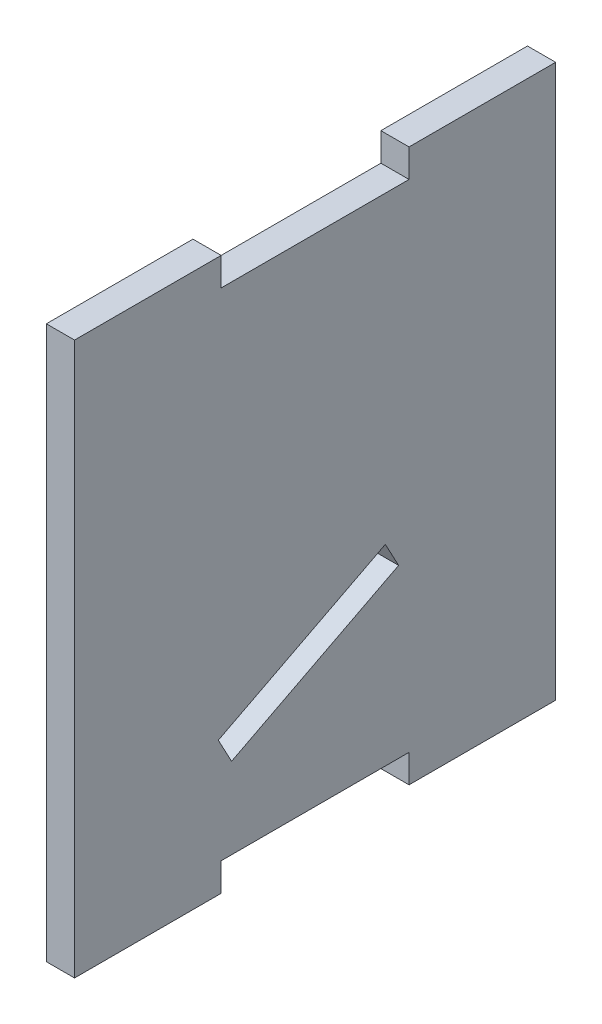
ISO-10303-21;
HEADER;
FILE_DESCRIPTION(('STEP AP214'),'2;1');
FILE_NAME('part.step','',(''),(''),'','','');
FILE_SCHEMA(('AUTOMOTIVE_DESIGN { 1 0 10303 214 1 1 1 1 }'));
ENDSEC;
DATA;
#1=APPLICATION_CONTEXT('core data for automotive mechanical design processes');
#2=APPLICATION_PROTOCOL_DEFINITION('international standard','automotive_design',2000,#1);
#3=PRODUCT_CONTEXT('',#1,'mechanical');
#4=PRODUCT('Part','Part','',(#3));
#5=PRODUCT_RELATED_PRODUCT_CATEGORY('part','',(#4));
#6=PRODUCT_DEFINITION_FORMATION('','',#4);
#7=PRODUCT_DEFINITION_CONTEXT('part definition',#1,'design');
#8=PRODUCT_DEFINITION('design','',#6,#7);
#9=PRODUCT_DEFINITION_SHAPE('','',#8);
#10=(LENGTH_UNIT() NAMED_UNIT(*) SI_UNIT(.MILLI.,.METRE.));
#11=(NAMED_UNIT(*) PLANE_ANGLE_UNIT() SI_UNIT($,.RADIAN.));
#12=(NAMED_UNIT(*) SI_UNIT($,.STERADIAN.) SOLID_ANGLE_UNIT());
#13=UNCERTAINTY_MEASURE_WITH_UNIT(LENGTH_MEASURE(1.E-05),#10,'distance_accuracy_value','');
#14=(GEOMETRIC_REPRESENTATION_CONTEXT(3) GLOBAL_UNCERTAINTY_ASSIGNED_CONTEXT((#13)) GLOBAL_UNIT_ASSIGNED_CONTEXT((#10,
#11,#12)) REPRESENTATION_CONTEXT('',''));
#15=CARTESIAN_POINT('',(0.,0.,0.));
#16=DIRECTION('',(0.,0.,1.));
#17=DIRECTION('',(1.,0.,0.));
#18=AXIS2_PLACEMENT_3D('',#15,#16,#17);
#19=CARTESIAN_POINT('',(-3.,3.,15.6043179111666));
#20=DIRECTION('',(0.,1.,0.));
#21=DIRECTION('',(0.,0.,1.));
#22=AXIS2_PLACEMENT_3D('',#19,#20,#21);
#23=PLANE('',#22);
#24=DIRECTION('',(0.,0.,1.));
#25=VECTOR('',#24,1.);
#26=CARTESIAN_POINT('',(0.,3.,15.6043179111666));
#27=LINE('',#26,#25);
#28=CARTESIAN_POINT('',(0.,3.,15.6043179111666));
#29=VERTEX_POINT('',#28);
#30=CARTESIAN_POINT('',(0.,3.,35.6043179111666));
#31=VERTEX_POINT('',#30);
#32=EDGE_CURVE('E192',#29,#31,#27,.T.);
#33=ORIENTED_EDGE('',*,*,#32,.T.);
#34=DIRECTION('',(1.,0.,0.));
#35=VECTOR('',#34,1.);
#36=CARTESIAN_POINT('',(-3.,3.,35.6043179111666));
#37=LINE('',#36,#35);
#38=CARTESIAN_POINT('',(-3.,3.,35.6043179111666));
#39=VERTEX_POINT('',#38);
#40=EDGE_CURVE('E11',#39,#31,#37,.T.);
#41=ORIENTED_EDGE('',*,*,#40,.F.);
#42=DIRECTION('',(0.,0.,1.));
#43=VECTOR('',#42,1.);
#44=CARTESIAN_POINT('',(-3.,3.,15.6043179111666));
#45=LINE('',#44,#43);
#46=CARTESIAN_POINT('',(-3.,3.,15.6043179111666));
#47=VERTEX_POINT('',#46);
#48=EDGE_CURVE('E199',#47,#39,#45,.T.);
#49=ORIENTED_EDGE('',*,*,#48,.F.);
#50=DIRECTION('',(1.,0.,0.));
#51=VECTOR('',#50,1.);
#52=CARTESIAN_POINT('',(-3.,3.,15.6043179111666));
#53=LINE('',#52,#51);
#54=EDGE_CURVE('E219',#47,#29,#53,.T.);
#55=ORIENTED_EDGE('',*,*,#54,.T.);
#56=EDGE_LOOP('',(#33,#41,#49,#55));
#57=FACE_BOUND('',#56,.T.);
#58=ADVANCED_FACE('F47',(#57),#23,.F.);
#59=CARTESIAN_POINT('',(-3.,3.,35.6043179111666));
#60=DIRECTION('',(0.,0.,1.));
#61=DIRECTION('',(1.,0.,0.));
#62=AXIS2_PLACEMENT_3D('',#59,#60,#61);
#63=PLANE('',#62);
#64=DIRECTION('',(0.,-1.,0.));
#65=VECTOR('',#64,1.);
#66=CARTESIAN_POINT('',(0.,3.,35.6043179111666));
#67=LINE('',#66,#65);
#68=CARTESIAN_POINT('',(0.,0.,35.6043179111666));
#69=VERTEX_POINT('',#68);
#70=EDGE_CURVE('E223',#31,#69,#67,.T.);
#71=ORIENTED_EDGE('',*,*,#70,.T.);
#72=DIRECTION('',(1.,0.,0.));
#73=VECTOR('',#72,1.);
#74=CARTESIAN_POINT('',(-3.,0.,35.6043179111666));
#75=LINE('',#74,#73);
#76=CARTESIAN_POINT('',(-3.,0.,35.6043179111666));
#77=VERTEX_POINT('',#76);
#78=EDGE_CURVE('E54',#77,#69,#75,.T.);
#79=ORIENTED_EDGE('',*,*,#78,.F.);
#80=DIRECTION('',(0.,-1.,0.));
#81=VECTOR('',#80,1.);
#82=CARTESIAN_POINT('',(-3.,3.,35.6043179111666));
#83=LINE('',#82,#81);
#84=EDGE_CURVE('E196',#39,#77,#83,.T.);
#85=ORIENTED_EDGE('',*,*,#84,.F.);
#86=ORIENTED_EDGE('',*,*,#40,.T.);
#87=EDGE_LOOP('',(#71,#79,#85,#86));
#88=FACE_BOUND('',#87,.T.);
#89=ADVANCED_FACE('F312',(#88),#63,.F.);
#90=CARTESIAN_POINT('',(-3.,0.,35.6043179111666));
#91=DIRECTION('',(0.,1.,0.));
#92=DIRECTION('',(0.,0.,1.));
#93=AXIS2_PLACEMENT_3D('',#90,#91,#92);
#94=PLANE('',#93);
#95=DIRECTION('',(0.,0.,1.));
#96=VECTOR('',#95,1.);
#97=CARTESIAN_POINT('',(0.,0.,35.6043179111666));
#98=LINE('',#97,#96);
#99=CARTESIAN_POINT('',(0.,0.,51.2086358223332));
#100=VERTEX_POINT('',#99);
#101=EDGE_CURVE('E226',#69,#100,#98,.T.);
#102=ORIENTED_EDGE('',*,*,#101,.T.);
#103=DIRECTION('',(1.,0.,0.));
#104=VECTOR('',#103,1.);
#105=CARTESIAN_POINT('',(-3.,0.,51.2086358223332));
#106=LINE('',#105,#104);
#107=CARTESIAN_POINT('',(-3.,0.,51.2086358223332));
#108=VERTEX_POINT('',#107);
#109=EDGE_CURVE('E284',#108,#100,#106,.T.);
#110=ORIENTED_EDGE('',*,*,#109,.F.);
#111=DIRECTION('',(0.,0.,1.));
#112=VECTOR('',#111,1.);
#113=CARTESIAN_POINT('',(-3.,0.,35.6043179111666));
#114=LINE('',#113,#112);
#115=EDGE_CURVE('E198',#77,#108,#114,.T.);
#116=ORIENTED_EDGE('',*,*,#115,.F.);
#117=ORIENTED_EDGE('',*,*,#78,.T.);
#118=EDGE_LOOP('',(#102,#110,#116,#117));
#119=FACE_BOUND('',#118,.T.);
#120=ADVANCED_FACE('F291',(#119),#94,.F.);
#121=CARTESIAN_POINT('',(-3.,0.,51.2086358223332));
#122=DIRECTION('',(0.,0.,-1.));
#123=DIRECTION('',(-1.,0.,0.));
#124=AXIS2_PLACEMENT_3D('',#121,#122,#123);
#125=PLANE('',#124);
#126=DIRECTION('',(0.,1.,0.));
#127=VECTOR('',#126,1.);
#128=CARTESIAN_POINT('',(0.,0.,51.2086358223332));
#129=LINE('',#128,#127);
#130=CARTESIAN_POINT('',(0.,58.8053013934878,51.2086358223332));
#131=VERTEX_POINT('',#130);
#132=EDGE_CURVE('E229',#100,#131,#129,.T.);
#133=ORIENTED_EDGE('',*,*,#132,.T.);
#134=DIRECTION('',(1.,0.,0.));
#135=VECTOR('',#134,1.);
#136=CARTESIAN_POINT('',(-3.,58.8053013934878,51.2086358223332));
#137=LINE('',#136,#135);
#138=CARTESIAN_POINT('',(-3.,58.8053013934878,51.2086358223332));
#139=VERTEX_POINT('',#138);
#140=EDGE_CURVE('E281',#139,#131,#137,.T.);
#141=ORIENTED_EDGE('',*,*,#140,.F.);
#142=DIRECTION('',(0.,1.,0.));
#143=VECTOR('',#142,1.);
#144=CARTESIAN_POINT('',(-3.,0.,51.2086358223332));
#145=LINE('',#144,#143);
#146=EDGE_CURVE('E201',#108,#139,#145,.T.);
#147=ORIENTED_EDGE('',*,*,#146,.F.);
#148=ORIENTED_EDGE('',*,*,#109,.T.);
#149=EDGE_LOOP('',(#133,#141,#147,#148));
#150=FACE_BOUND('',#149,.T.);
#151=ADVANCED_FACE('F300',(#150),#125,.F.);
#152=CARTESIAN_POINT('',(-3.,58.8053013934878,51.2086358223332));
#153=DIRECTION('',(0.,-1.,0.));
#154=DIRECTION('',(0.,0.,-1.));
#155=AXIS2_PLACEMENT_3D('',#152,#153,#154);
#156=PLANE('',#155);
#157=DIRECTION('',(0.,0.,-1.));
#158=VECTOR('',#157,1.);
#159=CARTESIAN_POINT('',(0.,58.8053013934878,51.2086358223332));
#160=LINE('',#159,#158);
#161=CARTESIAN_POINT('',(0.,58.8053013934878,35.6043179111666));
#162=VERTEX_POINT('',#161);
#163=EDGE_CURVE('E232',#131,#162,#160,.T.);
#164=ORIENTED_EDGE('',*,*,#163,.T.);
#165=DIRECTION('',(1.,0.,0.));
#166=VECTOR('',#165,1.);
#167=CARTESIAN_POINT('',(-3.,58.8053013934878,35.6043179111666));
#168=LINE('',#167,#166);
#169=CARTESIAN_POINT('',(-3.,58.8053013934878,35.6043179111666));
#170=VERTEX_POINT('',#169);
#171=EDGE_CURVE('E278',#170,#162,#168,.T.);
#172=ORIENTED_EDGE('',*,*,#171,.F.);
#173=DIRECTION('',(0.,0.,-1.));
#174=VECTOR('',#173,1.);
#175=CARTESIAN_POINT('',(-3.,58.8053013934878,51.2086358223332));
#176=LINE('',#175,#174);
#177=EDGE_CURVE('E203',#139,#170,#176,.T.);
#178=ORIENTED_EDGE('',*,*,#177,.F.);
#179=ORIENTED_EDGE('',*,*,#140,.T.);
#180=EDGE_LOOP('',(#164,#172,#178,#179));
#181=FACE_BOUND('',#180,.T.);
#182=ADVANCED_FACE('F304',(#181),#156,.F.);
#183=CARTESIAN_POINT('',(-3.,58.8053013934878,35.6043179111666));
#184=DIRECTION('',(0.,0.,1.));
#185=DIRECTION('',(1.,0.,0.));
#186=AXIS2_PLACEMENT_3D('',#183,#184,#185);
#187=PLANE('',#186);
#188=DIRECTION('',(0.,-1.,0.));
#189=VECTOR('',#188,1.);
#190=CARTESIAN_POINT('',(0.,58.8053013934878,35.6043179111666));
#191=LINE('',#190,#189);
#192=CARTESIAN_POINT('',(0.,55.8053013934878,35.6043179111666));
#193=VERTEX_POINT('',#192);
#194=EDGE_CURVE('E235',#162,#193,#191,.T.);
#195=ORIENTED_EDGE('',*,*,#194,.T.);
#196=DIRECTION('',(1.,0.,0.));
#197=VECTOR('',#196,1.);
#198=CARTESIAN_POINT('',(-3.,55.8053013934878,35.6043179111666));
#199=LINE('',#198,#197);
#200=CARTESIAN_POINT('',(-3.,55.8053013934878,35.6043179111666));
#201=VERTEX_POINT('',#200);
#202=EDGE_CURVE('E275',#201,#193,#199,.T.);
#203=ORIENTED_EDGE('',*,*,#202,.F.);
#204=DIRECTION('',(0.,-1.,0.));
#205=VECTOR('',#204,1.);
#206=CARTESIAN_POINT('',(-3.,58.8053013934878,35.6043179111666));
#207=LINE('',#206,#205);
#208=EDGE_CURVE('E205',#170,#201,#207,.T.);
#209=ORIENTED_EDGE('',*,*,#208,.F.);
#210=ORIENTED_EDGE('',*,*,#171,.T.);
#211=EDGE_LOOP('',(#195,#203,#209,#210));
#212=FACE_BOUND('',#211,.T.);
#213=ADVANCED_FACE('F345',(#212),#187,.F.);
#214=CARTESIAN_POINT('',(-3.,55.8053013934878,35.6043179111666));
#215=DIRECTION('',(0.,-1.,0.));
#216=DIRECTION('',(0.,0.,-1.));
#217=AXIS2_PLACEMENT_3D('',#214,#215,#216);
#218=PLANE('',#217);
#219=DIRECTION('',(0.,0.,-1.));
#220=VECTOR('',#219,1.);
#221=CARTESIAN_POINT('',(0.,55.8053013934878,35.6043179111666));
#222=LINE('',#221,#220);
#223=CARTESIAN_POINT('',(0.,55.8053013934878,15.6043179111666));
#224=VERTEX_POINT('',#223);
#225=EDGE_CURVE('E238',#193,#224,#222,.T.);
#226=ORIENTED_EDGE('',*,*,#225,.T.);
#227=DIRECTION('',(1.,0.,0.));
#228=VECTOR('',#227,1.);
#229=CARTESIAN_POINT('',(-3.,55.8053013934878,15.6043179111666));
#230=LINE('',#229,#228);
#231=CARTESIAN_POINT('',(-3.,55.8053013934878,15.6043179111666));
#232=VERTEX_POINT('',#231);
#233=EDGE_CURVE('E272',#232,#224,#230,.T.);
#234=ORIENTED_EDGE('',*,*,#233,.F.);
#235=DIRECTION('',(0.,0.,-1.));
#236=VECTOR('',#235,1.);
#237=CARTESIAN_POINT('',(-3.,55.8053013934878,35.6043179111666));
#238=LINE('',#237,#236);
#239=EDGE_CURVE('E207',#201,#232,#238,.T.);
#240=ORIENTED_EDGE('',*,*,#239,.F.);
#241=ORIENTED_EDGE('',*,*,#202,.T.);
#242=EDGE_LOOP('',(#226,#234,#240,#241));
#243=FACE_BOUND('',#242,.T.);
#244=ADVANCED_FACE('F343',(#243),#218,.F.);
#245=CARTESIAN_POINT('',(-3.,55.8053013934878,15.6043179111666));
#246=DIRECTION('',(0.,0.,-1.));
#247=DIRECTION('',(-1.,0.,0.));
#248=AXIS2_PLACEMENT_3D('',#245,#246,#247);
#249=PLANE('',#248);
#250=DIRECTION('',(0.,1.,0.));
#251=VECTOR('',#250,1.);
#252=CARTESIAN_POINT('',(0.,55.8053013934878,15.6043179111666));
#253=LINE('',#252,#251);
#254=CARTESIAN_POINT('',(0.,58.8053013934878,15.6043179111666));
#255=VERTEX_POINT('',#254);
#256=EDGE_CURVE('E241',#224,#255,#253,.T.);
#257=ORIENTED_EDGE('',*,*,#256,.T.);
#258=DIRECTION('',(1.,0.,0.));
#259=VECTOR('',#258,1.);
#260=CARTESIAN_POINT('',(-3.,58.8053013934878,15.6043179111666));
#261=LINE('',#260,#259);
#262=CARTESIAN_POINT('',(-3.,58.8053013934878,15.6043179111666));
#263=VERTEX_POINT('',#262);
#264=EDGE_CURVE('E269',#263,#255,#261,.T.);
#265=ORIENTED_EDGE('',*,*,#264,.F.);
#266=DIRECTION('',(0.,1.,0.));
#267=VECTOR('',#266,1.);
#268=CARTESIAN_POINT('',(-3.,55.8053013934878,15.6043179111666));
#269=LINE('',#268,#267);
#270=EDGE_CURVE('E209',#232,#263,#269,.T.);
#271=ORIENTED_EDGE('',*,*,#270,.F.);
#272=ORIENTED_EDGE('',*,*,#233,.T.);
#273=EDGE_LOOP('',(#257,#265,#271,#272));
#274=FACE_BOUND('',#273,.T.);
#275=ADVANCED_FACE('F339',(#274),#249,.F.);
#276=CARTESIAN_POINT('',(-3.,58.8053013934878,15.6043179111666));
#277=DIRECTION('',(0.,-1.,0.));
#278=DIRECTION('',(0.,0.,-1.));
#279=AXIS2_PLACEMENT_3D('',#276,#277,#278);
#280=PLANE('',#279);
#281=DIRECTION('',(0.,0.,-1.));
#282=VECTOR('',#281,1.);
#283=CARTESIAN_POINT('',(0.,58.8053013934878,15.6043179111666));
#284=LINE('',#283,#282);
#285=CARTESIAN_POINT('',(0.,58.8053013934878,0.));
#286=VERTEX_POINT('',#285);
#287=EDGE_CURVE('E244',#255,#286,#284,.T.);
#288=ORIENTED_EDGE('',*,*,#287,.T.);
#289=DIRECTION('',(1.,0.,0.));
#290=VECTOR('',#289,1.);
#291=CARTESIAN_POINT('',(-3.,58.8053013934878,0.));
#292=LINE('',#291,#290);
#293=CARTESIAN_POINT('',(-3.,58.8053013934878,0.));
#294=VERTEX_POINT('',#293);
#295=EDGE_CURVE('E266',#294,#286,#292,.T.);
#296=ORIENTED_EDGE('',*,*,#295,.F.);
#297=DIRECTION('',(0.,0.,-1.));
#298=VECTOR('',#297,1.);
#299=CARTESIAN_POINT('',(-3.,58.8053013934878,15.6043179111666));
#300=LINE('',#299,#298);
#301=EDGE_CURVE('E211',#263,#294,#300,.T.);
#302=ORIENTED_EDGE('',*,*,#301,.F.);
#303=ORIENTED_EDGE('',*,*,#264,.T.);
#304=EDGE_LOOP('',(#288,#296,#302,#303));
#305=FACE_BOUND('',#304,.T.);
#306=ADVANCED_FACE('F334',(#305),#280,.F.);
#307=CARTESIAN_POINT('',(-3.,58.8053013934878,0.));
#308=DIRECTION('',(0.,0.,1.));
#309=DIRECTION('',(0.,-1.,0.));
#310=AXIS2_PLACEMENT_3D('',#307,#308,#309);
#311=PLANE('',#310);
#312=DIRECTION('',(0.,-1.,0.));
#313=VECTOR('',#312,1.);
#314=CARTESIAN_POINT('',(0.,58.8053013934878,0.));
#315=LINE('',#314,#313);
#316=CARTESIAN_POINT('',(0.,0.,0.));
#317=VERTEX_POINT('',#316);
#318=EDGE_CURVE('E247',#286,#317,#315,.T.);
#319=ORIENTED_EDGE('',*,*,#318,.T.);
#320=DIRECTION('',(1.,0.,0.));
#321=VECTOR('',#320,1.);
#322=CARTESIAN_POINT('',(-3.,0.,0.));
#323=LINE('',#322,#321);
#324=CARTESIAN_POINT('',(-3.,0.,0.));
#325=VERTEX_POINT('',#324);
#326=EDGE_CURVE('E263',#325,#317,#323,.T.);
#327=ORIENTED_EDGE('',*,*,#326,.F.);
#328=DIRECTION('',(0.,-1.,0.));
#329=VECTOR('',#328,1.);
#330=CARTESIAN_POINT('',(-3.,58.8053013934878,0.));
#331=LINE('',#330,#329);
#332=EDGE_CURVE('E213',#294,#325,#331,.T.);
#333=ORIENTED_EDGE('',*,*,#332,.F.);
#334=ORIENTED_EDGE('',*,*,#295,.T.);
#335=EDGE_LOOP('',(#319,#327,#333,#334));
#336=FACE_BOUND('',#335,.T.);
#337=ADVANCED_FACE('F328',(#336),#311,.F.);
#338=CARTESIAN_POINT('',(-3.,0.,0.));
#339=DIRECTION('',(0.,1.,0.));
#340=DIRECTION('',(0.,0.,1.));
#341=AXIS2_PLACEMENT_3D('',#338,#339,#340);
#342=PLANE('',#341);
#343=DIRECTION('',(0.,0.,1.));
#344=VECTOR('',#343,1.);
#345=CARTESIAN_POINT('',(0.,0.,0.));
#346=LINE('',#345,#344);
#347=CARTESIAN_POINT('',(0.,0.,15.6043179111666));
#348=VERTEX_POINT('',#347);
#349=EDGE_CURVE('E250',#317,#348,#346,.T.);
#350=ORIENTED_EDGE('',*,*,#349,.T.);
#351=DIRECTION('',(1.,0.,0.));
#352=VECTOR('',#351,1.);
#353=CARTESIAN_POINT('',(-3.,0.,15.6043179111666));
#354=LINE('',#353,#352);
#355=CARTESIAN_POINT('',(-3.,0.,15.6043179111666));
#356=VERTEX_POINT('',#355);
#357=EDGE_CURVE('E260',#356,#348,#354,.T.);
#358=ORIENTED_EDGE('',*,*,#357,.F.);
#359=DIRECTION('',(0.,0.,1.));
#360=VECTOR('',#359,1.);
#361=CARTESIAN_POINT('',(-3.,0.,0.));
#362=LINE('',#361,#360);
#363=EDGE_CURVE('E215',#325,#356,#362,.T.);
#364=ORIENTED_EDGE('',*,*,#363,.F.);
#365=ORIENTED_EDGE('',*,*,#326,.T.);
#366=EDGE_LOOP('',(#350,#358,#364,#365));
#367=FACE_BOUND('',#366,.T.);
#368=ADVANCED_FACE('F324',(#367),#342,.F.);
#369=CARTESIAN_POINT('',(-3.,0.,15.6043179111666));
#370=DIRECTION('',(0.,0.,-1.));
#371=DIRECTION('',(-1.,0.,0.));
#372=AXIS2_PLACEMENT_3D('',#369,#370,#371);
#373=PLANE('',#372);
#374=DIRECTION('',(0.,1.,0.));
#375=VECTOR('',#374,1.);
#376=CARTESIAN_POINT('',(0.,0.,15.6043179111666));
#377=LINE('',#376,#375);
#378=EDGE_CURVE('E222',#348,#29,#377,.T.);
#379=ORIENTED_EDGE('',*,*,#378,.T.);
#380=ORIENTED_EDGE('',*,*,#54,.F.);
#381=DIRECTION('',(0.,1.,0.));
#382=VECTOR('',#381,1.);
#383=CARTESIAN_POINT('',(-3.,0.,15.6043179111666));
#384=LINE('',#383,#382);
#385=EDGE_CURVE('E217',#356,#47,#384,.T.);
#386=ORIENTED_EDGE('',*,*,#385,.F.);
#387=ORIENTED_EDGE('',*,*,#357,.T.);
#388=EDGE_LOOP('',(#379,#380,#386,#387));
#389=FACE_BOUND('',#388,.T.);
#390=ADVANCED_FACE('F319',(#389),#373,.F.);
#391=CARTESIAN_POINT('',(-3.,0.,0.));
#392=DIRECTION('',(1.,0.,0.));
#393=DIRECTION('',(0.,1.,0.));
#394=AXIS2_PLACEMENT_3D('',#391,#392,#393);
#395=PLANE('',#394);
#396=DIRECTION('',(0.,-0.458264423143931,0.888815908093774));
#397=VECTOR('',#396,1.);
#398=CARTESIAN_POINT('',(-3.,20.7852574655328,16.7143219694571));
#399=LINE('',#398,#397);
#400=CARTESIAN_POINT('',(-3.,20.7852574655328,16.7143219694571));
#401=VERTEX_POINT('',#400);
#402=CARTESIAN_POINT('',(-3.,11.6188000066265,34.4929074298909));
#403=VERTEX_POINT('',#402);
#404=EDGE_CURVE('E186',#401,#403,#399,.T.);
#405=ORIENTED_EDGE('',*,*,#404,.F.);
#406=DIRECTION('',(0.,-0.8822139650926,-0.470848722835256));
#407=VECTOR('',#406,1.);
#408=CARTESIAN_POINT('',(-3.,20.7852574655328,16.7143219694571));
#409=LINE('',#408,#407);
#410=CARTESIAN_POINT('',(-3.,23.4318993608106,18.1268681379629));
#411=VERTEX_POINT('',#410);
#412=EDGE_CURVE('E61',#411,#401,#409,.T.);
#413=ORIENTED_EDGE('',*,*,#412,.F.);
#414=DIRECTION('',(0.,0.458264423143931,-0.888815908093774));
#415=VECTOR('',#414,1.);
#416=CARTESIAN_POINT('',(-3.,14.2654419019043,35.9054535983966));
#417=LINE('',#416,#415);
#418=CARTESIAN_POINT('',(-3.,14.2654419019043,35.9054535983966));
#419=VERTEX_POINT('',#418);
#420=EDGE_CURVE('E177',#419,#411,#417,.T.);
#421=ORIENTED_EDGE('',*,*,#420,.F.);
#422=DIRECTION('',(0.,0.882213965092605,0.470848722835249));
#423=VECTOR('',#422,1.);
#424=CARTESIAN_POINT('',(-3.,11.6188000066265,34.4929074298909));
#425=LINE('',#424,#423);
#426=EDGE_CURVE('E180',#403,#419,#425,.T.);
#427=ORIENTED_EDGE('',*,*,#426,.F.);
#428=EDGE_LOOP('',(#405,#413,#421,#427));
#429=FACE_BOUND('',#428,.T.);
#430=ORIENTED_EDGE('',*,*,#48,.T.);
#431=ORIENTED_EDGE('',*,*,#84,.T.);
#432=ORIENTED_EDGE('',*,*,#115,.T.);
#433=ORIENTED_EDGE('',*,*,#146,.T.);
#434=ORIENTED_EDGE('',*,*,#177,.T.);
#435=ORIENTED_EDGE('',*,*,#208,.T.);
#436=ORIENTED_EDGE('',*,*,#239,.T.);
#437=ORIENTED_EDGE('',*,*,#270,.T.);
#438=ORIENTED_EDGE('',*,*,#301,.T.);
#439=ORIENTED_EDGE('',*,*,#332,.T.);
#440=ORIENTED_EDGE('',*,*,#363,.T.);
#441=ORIENTED_EDGE('',*,*,#385,.T.);
#442=EDGE_LOOP('',(#430,#431,#432,#433,#434,#435,#436,#437,#438,#439,#440,#441));
#443=FACE_BOUND('',#442,.T.);
#444=ADVANCED_FACE('F308',(#429,#443),#395,.F.);
#445=CARTESIAN_POINT('',(0.,0.,0.));
#446=DIRECTION('',(1.,0.,0.));
#447=DIRECTION('',(0.,1.,0.));
#448=AXIS2_PLACEMENT_3D('',#445,#446,#447);
#449=PLANE('',#448);
#450=DIRECTION('',(0.,-0.8822139650926,-0.470848722835256));
#451=VECTOR('',#450,1.);
#452=CARTESIAN_POINT('',(0.,20.7852574655328,16.7143219694571));
#453=LINE('',#452,#451);
#454=CARTESIAN_POINT('',(0.,23.4318993608106,18.1268681379629));
#455=VERTEX_POINT('',#454);
#456=CARTESIAN_POINT('',(0.,20.7852574655328,16.7143219694571));
#457=VERTEX_POINT('',#456);
#458=EDGE_CURVE('E161',#455,#457,#453,.T.);
#459=ORIENTED_EDGE('',*,*,#458,.T.);
#460=DIRECTION('',(0.,-0.458264423143931,0.888815908093774));
#461=VECTOR('',#460,1.);
#462=CARTESIAN_POINT('',(0.,20.7852574655328,16.7143219694571));
#463=LINE('',#462,#461);
#464=CARTESIAN_POINT('',(0.,11.6188000066265,34.4929074298909));
#465=VERTEX_POINT('',#464);
#466=EDGE_CURVE('E170',#457,#465,#463,.T.);
#467=ORIENTED_EDGE('',*,*,#466,.T.);
#468=DIRECTION('',(0.,0.882213965092605,0.470848722835249));
#469=VECTOR('',#468,1.);
#470=CARTESIAN_POINT('',(0.,11.6188000066265,34.4929074298909));
#471=LINE('',#470,#469);
#472=CARTESIAN_POINT('',(0.,14.2654419019043,35.9054535983966));
#473=VERTEX_POINT('',#472);
#474=EDGE_CURVE('E69',#465,#473,#471,.T.);
#475=ORIENTED_EDGE('',*,*,#474,.T.);
#476=DIRECTION('',(0.,0.458264423143931,-0.888815908093774));
#477=VECTOR('',#476,1.);
#478=CARTESIAN_POINT('',(0.,14.2654419019043,35.9054535983966));
#479=LINE('',#478,#477);
#480=EDGE_CURVE('E167',#473,#455,#479,.T.);
#481=ORIENTED_EDGE('',*,*,#480,.T.);
#482=EDGE_LOOP('',(#459,#467,#475,#481));
#483=FACE_BOUND('',#482,.T.);
#484=ORIENTED_EDGE('',*,*,#32,.F.);
#485=ORIENTED_EDGE('',*,*,#378,.F.);
#486=ORIENTED_EDGE('',*,*,#349,.F.);
#487=ORIENTED_EDGE('',*,*,#318,.F.);
#488=ORIENTED_EDGE('',*,*,#287,.F.);
#489=ORIENTED_EDGE('',*,*,#256,.F.);
#490=ORIENTED_EDGE('',*,*,#225,.F.);
#491=ORIENTED_EDGE('',*,*,#194,.F.);
#492=ORIENTED_EDGE('',*,*,#163,.F.);
#493=ORIENTED_EDGE('',*,*,#132,.F.);
#494=ORIENTED_EDGE('',*,*,#101,.F.);
#495=ORIENTED_EDGE('',*,*,#70,.F.);
#496=EDGE_LOOP('',(#484,#485,#486,#487,#488,#489,#490,#491,#492,#493,#494,#495));
#497=FACE_BOUND('',#496,.T.);
#498=ADVANCED_FACE('F174',(#483,#497),#449,.T.);
#499=CARTESIAN_POINT('',(0.,20.7852574655328,16.7143219694571));
#500=DIRECTION('',(0.,0.470848722835256,-0.8822139650926));
#501=DIRECTION('',(0.,0.8822139650926,0.470848722835256));
#502=AXIS2_PLACEMENT_3D('',#499,#500,#501);
#503=PLANE('',#502);
#504=ORIENTED_EDGE('',*,*,#412,.T.);
#505=DIRECTION('',(-1.,0.,0.));
#506=VECTOR('',#505,1.);
#507=CARTESIAN_POINT('',(0.,20.7852574655328,16.7143219694571));
#508=LINE('',#507,#506);
#509=EDGE_CURVE('E157',#457,#401,#508,.T.);
#510=ORIENTED_EDGE('',*,*,#509,.F.);
#511=ORIENTED_EDGE('',*,*,#458,.F.);
#512=DIRECTION('',(-1.,0.,0.));
#513=VECTOR('',#512,1.);
#514=CARTESIAN_POINT('',(0.,23.4318993608106,18.1268681379629));
#515=LINE('',#514,#513);
#516=EDGE_CURVE('E190',#455,#411,#515,.T.);
#517=ORIENTED_EDGE('',*,*,#516,.T.);
#518=EDGE_LOOP('',(#504,#510,#511,#517));
#519=FACE_BOUND('',#518,.T.);
#520=ADVANCED_FACE('F159',(#519),#503,.F.);
#521=CARTESIAN_POINT('',(0.,14.2654419019043,35.9054535983966));
#522=DIRECTION('',(0.,0.888815908093774,0.458264423143931));
#523=DIRECTION('',(0.,-0.458264423143931,0.888815908093774));
#524=AXIS2_PLACEMENT_3D('',#521,#522,#523);
#525=PLANE('',#524);
#526=ORIENTED_EDGE('',*,*,#420,.T.);
#527=ORIENTED_EDGE('',*,*,#516,.F.);
#528=ORIENTED_EDGE('',*,*,#480,.F.);
#529=DIRECTION('',(-1.,0.,0.));
#530=VECTOR('',#529,1.);
#531=CARTESIAN_POINT('',(0.,14.2654419019043,35.9054535983966));
#532=LINE('',#531,#530);
#533=EDGE_CURVE('E193',#473,#419,#532,.T.);
#534=ORIENTED_EDGE('',*,*,#533,.T.);
#535=EDGE_LOOP('',(#526,#527,#528,#534));
#536=FACE_BOUND('',#535,.T.);
#537=ADVANCED_FACE('F437',(#536),#525,.F.);
#538=CARTESIAN_POINT('',(0.,11.6188000066265,34.4929074298909));
#539=DIRECTION('',(0.,-0.470848722835249,0.882213965092604));
#540=DIRECTION('',(0.,-0.882213965092605,-0.470848722835249));
#541=AXIS2_PLACEMENT_3D('',#538,#539,#540);
#542=PLANE('',#541);
#543=ORIENTED_EDGE('',*,*,#426,.T.);
#544=ORIENTED_EDGE('',*,*,#533,.F.);
#545=ORIENTED_EDGE('',*,*,#474,.F.);
#546=DIRECTION('',(-1.,0.,0.));
#547=VECTOR('',#546,1.);
#548=CARTESIAN_POINT('',(0.,11.6188000066265,34.4929074298909));
#549=LINE('',#548,#547);
#550=EDGE_CURVE('E166',#465,#403,#549,.T.);
#551=ORIENTED_EDGE('',*,*,#550,.T.);
#552=EDGE_LOOP('',(#543,#544,#545,#551));
#553=FACE_BOUND('',#552,.T.);
#554=ADVANCED_FACE('F445',(#553),#542,.F.);
#555=CARTESIAN_POINT('',(0.,20.7852574655328,16.7143219694571));
#556=DIRECTION('',(0.,-0.888815908093774,-0.45826442314393));
#557=DIRECTION('',(0.,0.458264423143931,-0.888815908093774));
#558=AXIS2_PLACEMENT_3D('',#555,#556,#557);
#559=PLANE('',#558);
#560=ORIENTED_EDGE('',*,*,#404,.T.);
#561=ORIENTED_EDGE('',*,*,#550,.F.);
#562=ORIENTED_EDGE('',*,*,#466,.F.);
#563=ORIENTED_EDGE('',*,*,#509,.T.);
#564=EDGE_LOOP('',(#560,#561,#562,#563));
#565=FACE_BOUND('',#564,.T.);
#566=ADVANCED_FACE('F171',(#565),#559,.F.);
#567=CLOSED_SHELL('',(#58,#89,#120,#151,#182,#213,#244,#275,#306,#337,#368,#390,#444,#498,#520,
#537,#554,#566));
#568=MANIFOLD_SOLID_BREP('B2',#567);
#569=ADVANCED_BREP_SHAPE_REPRESENTATION('',(#18,#568),#14);
#570=SHAPE_DEFINITION_REPRESENTATION(#9,#569);
ENDSEC;
END-ISO-10303-21;
